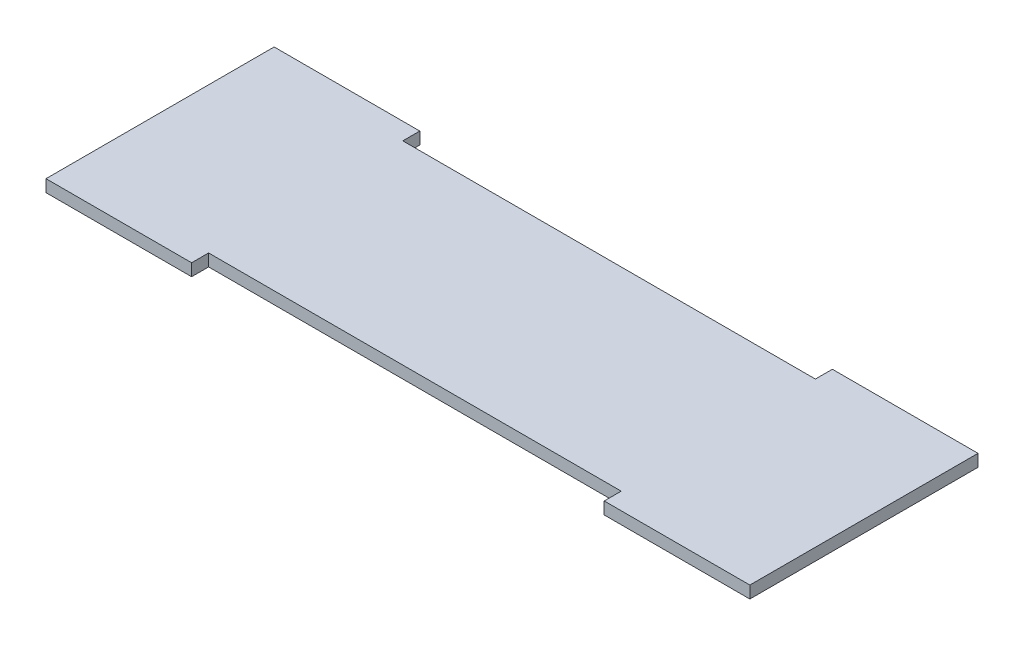
ISO-10303-21;
HEADER;
FILE_DESCRIPTION(('STEP AP214'),'2;1');
FILE_NAME('part.step','',(''),(''),'','','');
FILE_SCHEMA(('AUTOMOTIVE_DESIGN { 1 0 10303 214 1 1 1 1 }'));
ENDSEC;
DATA;
#1=APPLICATION_CONTEXT('core data for automotive mechanical design processes');
#2=APPLICATION_PROTOCOL_DEFINITION('international standard','automotive_design',2000,#1);
#3=PRODUCT_CONTEXT('',#1,'mechanical');
#4=PRODUCT('Part','Part','',(#3));
#5=PRODUCT_RELATED_PRODUCT_CATEGORY('part','',(#4));
#6=PRODUCT_DEFINITION_FORMATION('','',#4);
#7=PRODUCT_DEFINITION_CONTEXT('part definition',#1,'design');
#8=PRODUCT_DEFINITION('design','',#6,#7);
#9=PRODUCT_DEFINITION_SHAPE('','',#8);
#10=(LENGTH_UNIT() NAMED_UNIT(*) SI_UNIT(.MILLI.,.METRE.));
#11=(NAMED_UNIT(*) PLANE_ANGLE_UNIT() SI_UNIT($,.RADIAN.));
#12=(NAMED_UNIT(*) SI_UNIT($,.STERADIAN.) SOLID_ANGLE_UNIT());
#13=UNCERTAINTY_MEASURE_WITH_UNIT(LENGTH_MEASURE(1.E-05),#10,'distance_accuracy_value','');
#14=(GEOMETRIC_REPRESENTATION_CONTEXT(3) GLOBAL_UNCERTAINTY_ASSIGNED_CONTEXT((#13)) GLOBAL_UNIT_ASSIGNED_CONTEXT((#10,
#11,#12)) REPRESENTATION_CONTEXT('',''));
#15=CARTESIAN_POINT('',(0.,0.,0.));
#16=DIRECTION('',(0.,0.,1.));
#17=DIRECTION('',(1.,0.,0.));
#18=AXIS2_PLACEMENT_3D('',#15,#16,#17);
#19=CARTESIAN_POINT('',(-145.,5.,47.));
#20=DIRECTION('',(1.,0.,0.));
#21=DIRECTION('',(0.,0.,-1.));
#22=AXIS2_PLACEMENT_3D('',#19,#20,#21);
#23=PLANE('',#22);
#24=DIRECTION('',(0.,0.,1.));
#25=VECTOR('',#24,1.);
#26=CARTESIAN_POINT('',(-145.,0.,47.));
#27=LINE('',#26,#25);
#28=CARTESIAN_POINT('',(-145.,0.,-47.));
#29=VERTEX_POINT('',#28);
#30=CARTESIAN_POINT('',(-145.,0.,47.));
#31=VERTEX_POINT('',#30);
#32=EDGE_CURVE('E159',#29,#31,#27,.T.);
#33=ORIENTED_EDGE('',*,*,#32,.T.);
#34=DIRECTION('',(0.,-1.,0.));
#35=VECTOR('',#34,1.);
#36=CARTESIAN_POINT('',(-145.,5.,47.));
#37=LINE('',#36,#35);
#38=CARTESIAN_POINT('',(-145.,5.,47.));
#39=VERTEX_POINT('',#38);
#40=EDGE_CURVE('E11',#39,#31,#37,.T.);
#41=ORIENTED_EDGE('',*,*,#40,.F.);
#42=DIRECTION('',(0.,0.,1.));
#43=VECTOR('',#42,1.);
#44=CARTESIAN_POINT('',(-145.,5.,47.));
#45=LINE('',#44,#43);
#46=CARTESIAN_POINT('',(-145.,5.,-47.));
#47=VERTEX_POINT('',#46);
#48=EDGE_CURVE('E181',#47,#39,#45,.T.);
#49=ORIENTED_EDGE('',*,*,#48,.F.);
#50=DIRECTION('',(0.,-1.,0.));
#51=VECTOR('',#50,1.);
#52=CARTESIAN_POINT('',(-145.,5.,-47.));
#53=LINE('',#52,#51);
#54=EDGE_CURVE('E155',#47,#29,#53,.T.);
#55=ORIENTED_EDGE('',*,*,#54,.T.);
#56=EDGE_LOOP('',(#33,#41,#49,#55));
#57=FACE_BOUND('',#56,.T.);
#58=ADVANCED_FACE('F39',(#57),#23,.F.);
#59=CARTESIAN_POINT('',(-85.,5.,47.));
#60=DIRECTION('',(0.,0.,-1.));
#61=DIRECTION('',(-1.,0.,0.));
#62=AXIS2_PLACEMENT_3D('',#59,#60,#61);
#63=PLANE('',#62);
#64=DIRECTION('',(1.,0.,0.));
#65=VECTOR('',#64,1.);
#66=CARTESIAN_POINT('',(-85.,0.,47.));
#67=LINE('',#66,#65);
#68=CARTESIAN_POINT('',(-85.,0.,47.));
#69=VERTEX_POINT('',#68);
#70=EDGE_CURVE('E162',#31,#69,#67,.T.);
#71=ORIENTED_EDGE('',*,*,#70,.T.);
#72=DIRECTION('',(0.,-1.,0.));
#73=VECTOR('',#72,1.);
#74=CARTESIAN_POINT('',(-85.,5.,47.));
#75=LINE('',#74,#73);
#76=CARTESIAN_POINT('',(-85.,5.,47.));
#77=VERTEX_POINT('',#76);
#78=EDGE_CURVE('E47',#77,#69,#75,.T.);
#79=ORIENTED_EDGE('',*,*,#78,.F.);
#80=DIRECTION('',(1.,0.,0.));
#81=VECTOR('',#80,1.);
#82=CARTESIAN_POINT('',(-85.,5.,47.));
#83=LINE('',#82,#81);
#84=EDGE_CURVE('E110',#39,#77,#83,.T.);
#85=ORIENTED_EDGE('',*,*,#84,.F.);
#86=ORIENTED_EDGE('',*,*,#40,.T.);
#87=EDGE_LOOP('',(#71,#79,#85,#86));
#88=FACE_BOUND('',#87,.T.);
#89=ADVANCED_FACE('F259',(#88),#63,.F.);
#90=CARTESIAN_POINT('',(-85.,5.,40.));
#91=DIRECTION('',(-1.,0.,0.));
#92=DIRECTION('',(0.,0.,1.));
#93=AXIS2_PLACEMENT_3D('',#90,#91,#92);
#94=PLANE('',#93);
#95=DIRECTION('',(0.,0.,-1.));
#96=VECTOR('',#95,1.);
#97=CARTESIAN_POINT('',(-85.,0.,40.));
#98=LINE('',#97,#96);
#99=CARTESIAN_POINT('',(-85.,0.,40.));
#100=VERTEX_POINT('',#99);
#101=EDGE_CURVE('E164',#69,#100,#98,.T.);
#102=ORIENTED_EDGE('',*,*,#101,.T.);
#103=DIRECTION('',(0.,-1.,0.));
#104=VECTOR('',#103,1.);
#105=CARTESIAN_POINT('',(-85.,5.,40.));
#106=LINE('',#105,#104);
#107=CARTESIAN_POINT('',(-85.,5.,40.));
#108=VERTEX_POINT('',#107);
#109=EDGE_CURVE('E200',#108,#100,#106,.T.);
#110=ORIENTED_EDGE('',*,*,#109,.F.);
#111=DIRECTION('',(0.,0.,-1.));
#112=VECTOR('',#111,1.);
#113=CARTESIAN_POINT('',(-85.,5.,40.));
#114=LINE('',#113,#112);
#115=EDGE_CURVE('E208',#77,#108,#114,.T.);
#116=ORIENTED_EDGE('',*,*,#115,.F.);
#117=ORIENTED_EDGE('',*,*,#78,.T.);
#118=EDGE_LOOP('',(#102,#110,#116,#117));
#119=FACE_BOUND('',#118,.T.);
#120=ADVANCED_FACE('F206',(#119),#94,.F.);
#121=CARTESIAN_POINT('',(85.,5.,40.));
#122=DIRECTION('',(0.,0.,-1.));
#123=DIRECTION('',(-1.,0.,0.));
#124=AXIS2_PLACEMENT_3D('',#121,#122,#123);
#125=PLANE('',#124);
#126=DIRECTION('',(1.,0.,0.));
#127=VECTOR('',#126,1.);
#128=CARTESIAN_POINT('',(85.,0.,40.));
#129=LINE('',#128,#127);
#130=CARTESIAN_POINT('',(85.,0.,40.));
#131=VERTEX_POINT('',#130);
#132=EDGE_CURVE('E166',#100,#131,#129,.T.);
#133=ORIENTED_EDGE('',*,*,#132,.T.);
#134=DIRECTION('',(0.,-1.,0.));
#135=VECTOR('',#134,1.);
#136=CARTESIAN_POINT('',(85.,5.,40.));
#137=LINE('',#136,#135);
#138=CARTESIAN_POINT('',(85.,5.,40.));
#139=VERTEX_POINT('',#138);
#140=EDGE_CURVE('E197',#139,#131,#137,.T.);
#141=ORIENTED_EDGE('',*,*,#140,.F.);
#142=DIRECTION('',(1.,0.,0.));
#143=VECTOR('',#142,1.);
#144=CARTESIAN_POINT('',(85.,5.,40.));
#145=LINE('',#144,#143);
#146=EDGE_CURVE('E226',#108,#139,#145,.T.);
#147=ORIENTED_EDGE('',*,*,#146,.F.);
#148=ORIENTED_EDGE('',*,*,#109,.T.);
#149=EDGE_LOOP('',(#133,#141,#147,#148));
#150=FACE_BOUND('',#149,.T.);
#151=ADVANCED_FACE('F217',(#150),#125,.F.);
#152=CARTESIAN_POINT('',(85.,5.,47.));
#153=DIRECTION('',(1.,0.,0.));
#154=DIRECTION('',(0.,0.,-1.));
#155=AXIS2_PLACEMENT_3D('',#152,#153,#154);
#156=PLANE('',#155);
#157=DIRECTION('',(0.,0.,1.));
#158=VECTOR('',#157,1.);
#159=CARTESIAN_POINT('',(85.,0.,47.));
#160=LINE('',#159,#158);
#161=CARTESIAN_POINT('',(85.,0.,47.));
#162=VERTEX_POINT('',#161);
#163=EDGE_CURVE('E168',#131,#162,#160,.T.);
#164=ORIENTED_EDGE('',*,*,#163,.T.);
#165=DIRECTION('',(0.,-1.,0.));
#166=VECTOR('',#165,1.);
#167=CARTESIAN_POINT('',(85.,5.,47.));
#168=LINE('',#167,#166);
#169=CARTESIAN_POINT('',(85.,5.,47.));
#170=VERTEX_POINT('',#169);
#171=EDGE_CURVE('E194',#170,#162,#168,.T.);
#172=ORIENTED_EDGE('',*,*,#171,.F.);
#173=DIRECTION('',(0.,0.,1.));
#174=VECTOR('',#173,1.);
#175=CARTESIAN_POINT('',(85.,5.,47.));
#176=LINE('',#175,#174);
#177=EDGE_CURVE('E223',#139,#170,#176,.T.);
#178=ORIENTED_EDGE('',*,*,#177,.F.);
#179=ORIENTED_EDGE('',*,*,#140,.T.);
#180=EDGE_LOOP('',(#164,#172,#178,#179));
#181=FACE_BOUND('',#180,.T.);
#182=ADVANCED_FACE('F221',(#181),#156,.F.);
#183=CARTESIAN_POINT('',(145.,5.,47.));
#184=DIRECTION('',(0.,0.,-1.));
#185=DIRECTION('',(-1.,0.,0.));
#186=AXIS2_PLACEMENT_3D('',#183,#184,#185);
#187=PLANE('',#186);
#188=DIRECTION('',(1.,0.,0.));
#189=VECTOR('',#188,1.);
#190=CARTESIAN_POINT('',(145.,0.,47.));
#191=LINE('',#190,#189);
#192=CARTESIAN_POINT('',(145.,0.,47.));
#193=VERTEX_POINT('',#192);
#194=EDGE_CURVE('E170',#162,#193,#191,.T.);
#195=ORIENTED_EDGE('',*,*,#194,.T.);
#196=DIRECTION('',(0.,-1.,0.));
#197=VECTOR('',#196,1.);
#198=CARTESIAN_POINT('',(145.,5.,47.));
#199=LINE('',#198,#197);
#200=CARTESIAN_POINT('',(145.,5.,47.));
#201=VERTEX_POINT('',#200);
#202=EDGE_CURVE('E191',#201,#193,#199,.T.);
#203=ORIENTED_EDGE('',*,*,#202,.F.);
#204=DIRECTION('',(1.,0.,0.));
#205=VECTOR('',#204,1.);
#206=CARTESIAN_POINT('',(145.,5.,47.));
#207=LINE('',#206,#205);
#208=EDGE_CURVE('E225',#170,#201,#207,.T.);
#209=ORIENTED_EDGE('',*,*,#208,.F.);
#210=ORIENTED_EDGE('',*,*,#171,.T.);
#211=EDGE_LOOP('',(#195,#203,#209,#210));
#212=FACE_BOUND('',#211,.T.);
#213=ADVANCED_FACE('F272',(#212),#187,.F.);
#214=CARTESIAN_POINT('',(145.,5.,-47.));
#215=DIRECTION('',(-1.,0.,0.));
#216=DIRECTION('',(0.,0.,1.));
#217=AXIS2_PLACEMENT_3D('',#214,#215,#216);
#218=PLANE('',#217);
#219=DIRECTION('',(0.,0.,-1.));
#220=VECTOR('',#219,1.);
#221=CARTESIAN_POINT('',(145.,0.,-47.));
#222=LINE('',#221,#220);
#223=CARTESIAN_POINT('',(145.,0.,-47.));
#224=VERTEX_POINT('',#223);
#225=EDGE_CURVE('E172',#193,#224,#222,.T.);
#226=ORIENTED_EDGE('',*,*,#225,.T.);
#227=DIRECTION('',(0.,-1.,0.));
#228=VECTOR('',#227,1.);
#229=CARTESIAN_POINT('',(145.,5.,-47.));
#230=LINE('',#229,#228);
#231=CARTESIAN_POINT('',(145.,5.,-47.));
#232=VERTEX_POINT('',#231);
#233=EDGE_CURVE('E188',#232,#224,#230,.T.);
#234=ORIENTED_EDGE('',*,*,#233,.F.);
#235=DIRECTION('',(0.,0.,-1.));
#236=VECTOR('',#235,1.);
#237=CARTESIAN_POINT('',(145.,5.,-47.));
#238=LINE('',#237,#236);
#239=EDGE_CURVE('E228',#201,#232,#238,.T.);
#240=ORIENTED_EDGE('',*,*,#239,.F.);
#241=ORIENTED_EDGE('',*,*,#202,.T.);
#242=EDGE_LOOP('',(#226,#234,#240,#241));
#243=FACE_BOUND('',#242,.T.);
#244=ADVANCED_FACE('F275',(#243),#218,.F.);
#245=CARTESIAN_POINT('',(85.,5.,-47.));
#246=DIRECTION('',(0.,0.,1.));
#247=DIRECTION('',(1.,0.,0.));
#248=AXIS2_PLACEMENT_3D('',#245,#246,#247);
#249=PLANE('',#248);
#250=DIRECTION('',(-1.,0.,0.));
#251=VECTOR('',#250,1.);
#252=CARTESIAN_POINT('',(85.,0.,-47.));
#253=LINE('',#252,#251);
#254=CARTESIAN_POINT('',(85.,0.,-47.));
#255=VERTEX_POINT('',#254);
#256=EDGE_CURVE('E174',#224,#255,#253,.T.);
#257=ORIENTED_EDGE('',*,*,#256,.T.);
#258=DIRECTION('',(0.,-1.,0.));
#259=VECTOR('',#258,1.);
#260=CARTESIAN_POINT('',(85.,5.,-47.));
#261=LINE('',#260,#259);
#262=CARTESIAN_POINT('',(85.,5.,-47.));
#263=VERTEX_POINT('',#262);
#264=EDGE_CURVE('E185',#263,#255,#261,.T.);
#265=ORIENTED_EDGE('',*,*,#264,.F.);
#266=DIRECTION('',(-1.,0.,0.));
#267=VECTOR('',#266,1.);
#268=CARTESIAN_POINT('',(85.,5.,-47.));
#269=LINE('',#268,#267);
#270=EDGE_CURVE('E234',#232,#263,#269,.T.);
#271=ORIENTED_EDGE('',*,*,#270,.F.);
#272=ORIENTED_EDGE('',*,*,#233,.T.);
#273=EDGE_LOOP('',(#257,#265,#271,#272));
#274=FACE_BOUND('',#273,.T.);
#275=ADVANCED_FACE('F240',(#274),#249,.F.);
#276=CARTESIAN_POINT('',(85.,5.,-40.));
#277=DIRECTION('',(1.,0.,0.));
#278=DIRECTION('',(0.,0.,-1.));
#279=AXIS2_PLACEMENT_3D('',#276,#277,#278);
#280=PLANE('',#279);
#281=DIRECTION('',(0.,0.,1.));
#282=VECTOR('',#281,1.);
#283=CARTESIAN_POINT('',(85.,0.,-40.));
#284=LINE('',#283,#282);
#285=CARTESIAN_POINT('',(85.,0.,-40.));
#286=VERTEX_POINT('',#285);
#287=EDGE_CURVE('E176',#255,#286,#284,.T.);
#288=ORIENTED_EDGE('',*,*,#287,.T.);
#289=DIRECTION('',(0.,-1.,0.));
#290=VECTOR('',#289,1.);
#291=CARTESIAN_POINT('',(85.,5.,-40.));
#292=LINE('',#291,#290);
#293=CARTESIAN_POINT('',(85.,5.,-40.));
#294=VERTEX_POINT('',#293);
#295=EDGE_CURVE('E150',#294,#286,#292,.T.);
#296=ORIENTED_EDGE('',*,*,#295,.F.);
#297=DIRECTION('',(0.,0.,1.));
#298=VECTOR('',#297,1.);
#299=CARTESIAN_POINT('',(85.,5.,-40.));
#300=LINE('',#299,#298);
#301=EDGE_CURVE('E141',#263,#294,#300,.T.);
#302=ORIENTED_EDGE('',*,*,#301,.F.);
#303=ORIENTED_EDGE('',*,*,#264,.T.);
#304=EDGE_LOOP('',(#288,#296,#302,#303));
#305=FACE_BOUND('',#304,.T.);
#306=ADVANCED_FACE('F244',(#305),#280,.F.);
#307=CARTESIAN_POINT('',(-85.,5.,-40.));
#308=DIRECTION('',(0.,0.,1.));
#309=DIRECTION('',(1.,0.,0.));
#310=AXIS2_PLACEMENT_3D('',#307,#308,#309);
#311=PLANE('',#310);
#312=DIRECTION('',(-1.,0.,0.));
#313=VECTOR('',#312,1.);
#314=CARTESIAN_POINT('',(-85.,0.,-40.));
#315=LINE('',#314,#313);
#316=CARTESIAN_POINT('',(-85.,0.,-40.));
#317=VERTEX_POINT('',#316);
#318=EDGE_CURVE('E149',#286,#317,#315,.T.);
#319=ORIENTED_EDGE('',*,*,#318,.T.);
#320=DIRECTION('',(0.,-1.,0.));
#321=VECTOR('',#320,1.);
#322=CARTESIAN_POINT('',(-85.,5.,-40.));
#323=LINE('',#322,#321);
#324=CARTESIAN_POINT('',(-85.,5.,-40.));
#325=VERTEX_POINT('',#324);
#326=EDGE_CURVE('E146',#325,#317,#323,.T.);
#327=ORIENTED_EDGE('',*,*,#326,.F.);
#328=DIRECTION('',(-1.,0.,0.));
#329=VECTOR('',#328,1.);
#330=CARTESIAN_POINT('',(-85.,5.,-40.));
#331=LINE('',#330,#329);
#332=EDGE_CURVE('E135',#294,#325,#331,.T.);
#333=ORIENTED_EDGE('',*,*,#332,.F.);
#334=ORIENTED_EDGE('',*,*,#295,.T.);
#335=EDGE_LOOP('',(#319,#327,#333,#334));
#336=FACE_BOUND('',#335,.T.);
#337=ADVANCED_FACE('F147',(#336),#311,.F.);
#338=CARTESIAN_POINT('',(-85.,5.,-47.));
#339=DIRECTION('',(-1.,0.,0.));
#340=DIRECTION('',(0.,0.,1.));
#341=AXIS2_PLACEMENT_3D('',#338,#339,#340);
#342=PLANE('',#341);
#343=DIRECTION('',(0.,0.,-1.));
#344=VECTOR('',#343,1.);
#345=CARTESIAN_POINT('',(-85.,0.,-47.));
#346=LINE('',#345,#344);
#347=CARTESIAN_POINT('',(-85.,0.,-47.));
#348=VERTEX_POINT('',#347);
#349=EDGE_CURVE('E96',#317,#348,#346,.T.);
#350=ORIENTED_EDGE('',*,*,#349,.T.);
#351=DIRECTION('',(0.,-1.,0.));
#352=VECTOR('',#351,1.);
#353=CARTESIAN_POINT('',(-85.,5.,-47.));
#354=LINE('',#353,#352);
#355=CARTESIAN_POINT('',(-85.,5.,-47.));
#356=VERTEX_POINT('',#355);
#357=EDGE_CURVE('E151',#356,#348,#354,.T.);
#358=ORIENTED_EDGE('',*,*,#357,.F.);
#359=DIRECTION('',(0.,0.,-1.));
#360=VECTOR('',#359,1.);
#361=CARTESIAN_POINT('',(-85.,5.,-47.));
#362=LINE('',#361,#360);
#363=EDGE_CURVE('E139',#325,#356,#362,.T.);
#364=ORIENTED_EDGE('',*,*,#363,.F.);
#365=ORIENTED_EDGE('',*,*,#326,.T.);
#366=EDGE_LOOP('',(#350,#358,#364,#365));
#367=FACE_BOUND('',#366,.T.);
#368=ADVANCED_FACE('F153',(#367),#342,.F.);
#369=CARTESIAN_POINT('',(-145.,5.,-47.));
#370=DIRECTION('',(0.,0.,1.));
#371=DIRECTION('',(1.,0.,0.));
#372=AXIS2_PLACEMENT_3D('',#369,#370,#371);
#373=PLANE('',#372);
#374=DIRECTION('',(-1.,0.,0.));
#375=VECTOR('',#374,1.);
#376=CARTESIAN_POINT('',(-145.,0.,-47.));
#377=LINE('',#376,#375);
#378=EDGE_CURVE('E102',#348,#29,#377,.T.);
#379=ORIENTED_EDGE('',*,*,#378,.T.);
#380=ORIENTED_EDGE('',*,*,#54,.F.);
#381=DIRECTION('',(-1.,0.,0.));
#382=VECTOR('',#381,1.);
#383=CARTESIAN_POINT('',(-145.,5.,-47.));
#384=LINE('',#383,#382);
#385=EDGE_CURVE('E55',#356,#47,#384,.T.);
#386=ORIENTED_EDGE('',*,*,#385,.F.);
#387=ORIENTED_EDGE('',*,*,#357,.T.);
#388=EDGE_LOOP('',(#379,#380,#386,#387));
#389=FACE_BOUND('',#388,.T.);
#390=ADVANCED_FACE('F248',(#389),#373,.F.);
#391=CARTESIAN_POINT('',(0.,5.,0.));
#392=DIRECTION('',(0.,-1.,0.));
#393=DIRECTION('',(0.,0.,-1.));
#394=AXIS2_PLACEMENT_3D('',#391,#392,#393);
#395=PLANE('',#394);
#396=ORIENTED_EDGE('',*,*,#48,.T.);
#397=ORIENTED_EDGE('',*,*,#84,.T.);
#398=ORIENTED_EDGE('',*,*,#115,.T.);
#399=ORIENTED_EDGE('',*,*,#146,.T.);
#400=ORIENTED_EDGE('',*,*,#177,.T.);
#401=ORIENTED_EDGE('',*,*,#208,.T.);
#402=ORIENTED_EDGE('',*,*,#239,.T.);
#403=ORIENTED_EDGE('',*,*,#270,.T.);
#404=ORIENTED_EDGE('',*,*,#301,.T.);
#405=ORIENTED_EDGE('',*,*,#332,.T.);
#406=ORIENTED_EDGE('',*,*,#363,.T.);
#407=ORIENTED_EDGE('',*,*,#385,.T.);
#408=EDGE_LOOP('',(#396,#397,#398,#399,#400,#401,#402,#403,#404,#405,#406,#407));
#409=FACE_BOUND('',#408,.T.);
#410=ADVANCED_FACE('F137',(#409),#395,.F.);
#411=CARTESIAN_POINT('',(0.,0.,0.));
#412=DIRECTION('',(0.,-1.,0.));
#413=DIRECTION('',(0.,0.,-1.));
#414=AXIS2_PLACEMENT_3D('',#411,#412,#413);
#415=PLANE('',#414);
#416=ORIENTED_EDGE('',*,*,#32,.F.);
#417=ORIENTED_EDGE('',*,*,#378,.F.);
#418=ORIENTED_EDGE('',*,*,#349,.F.);
#419=ORIENTED_EDGE('',*,*,#318,.F.);
#420=ORIENTED_EDGE('',*,*,#287,.F.);
#421=ORIENTED_EDGE('',*,*,#256,.F.);
#422=ORIENTED_EDGE('',*,*,#225,.F.);
#423=ORIENTED_EDGE('',*,*,#194,.F.);
#424=ORIENTED_EDGE('',*,*,#163,.F.);
#425=ORIENTED_EDGE('',*,*,#132,.F.);
#426=ORIENTED_EDGE('',*,*,#101,.F.);
#427=ORIENTED_EDGE('',*,*,#70,.F.);
#428=EDGE_LOOP('',(#416,#417,#418,#419,#420,#421,#422,#423,#424,#425,#426,#427));
#429=FACE_BOUND('',#428,.T.);
#430=ADVANCED_FACE('F212',(#429),#415,.T.);
#431=CLOSED_SHELL('',(#58,#89,#120,#151,#182,#213,#244,#275,#306,#337,#368,#390,#410,#430));
#432=MANIFOLD_SOLID_BREP('B2',#431);
#433=ADVANCED_BREP_SHAPE_REPRESENTATION('',(#18,#432),#14);
#434=SHAPE_DEFINITION_REPRESENTATION(#9,#433);
ENDSEC;
END-ISO-10303-21;
